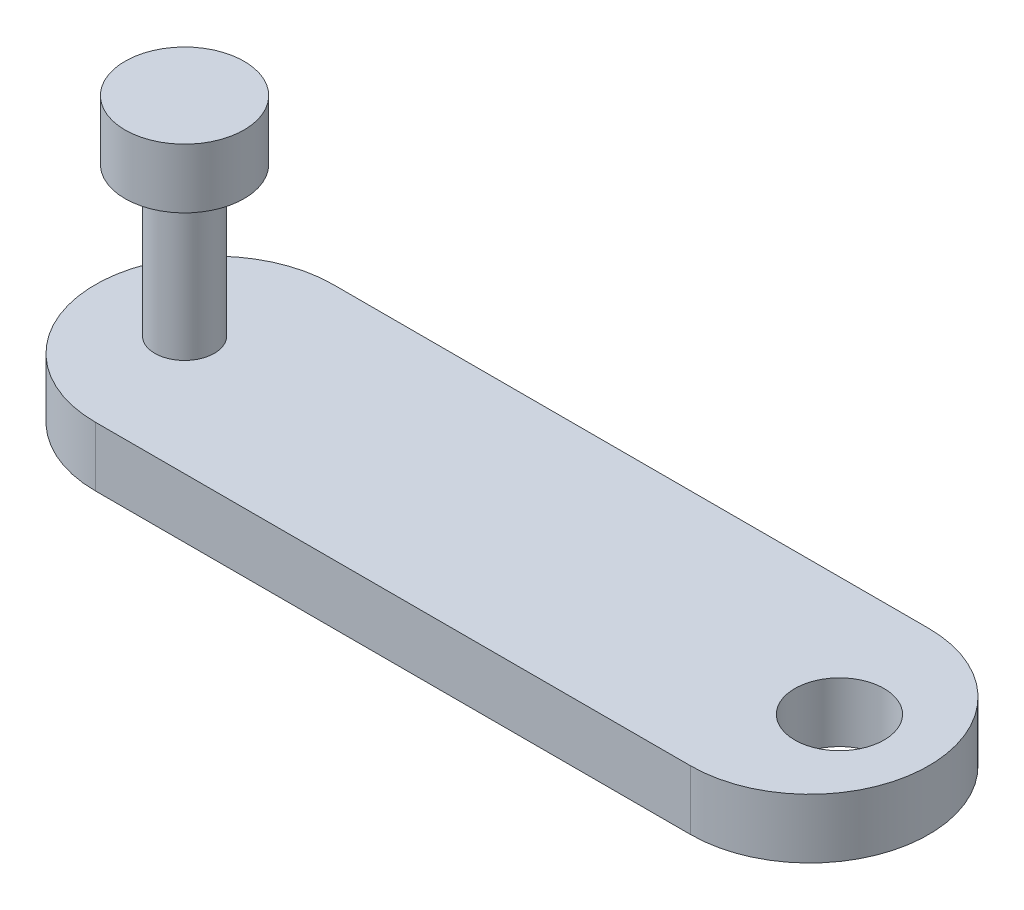
ISO-10303-21;
HEADER;
FILE_DESCRIPTION(('STEP AP214'),'2;1');
FILE_NAME('part.step','',(''),(''),'','','');
FILE_SCHEMA(('AUTOMOTIVE_DESIGN { 1 0 10303 214 1 1 1 1 }'));
ENDSEC;
DATA;
#1=APPLICATION_CONTEXT('core data for automotive mechanical design processes');
#2=APPLICATION_PROTOCOL_DEFINITION('international standard','automotive_design',2000,#1);
#3=PRODUCT_CONTEXT('',#1,'mechanical');
#4=PRODUCT('Part','Part','',(#3));
#5=PRODUCT_RELATED_PRODUCT_CATEGORY('part','',(#4));
#6=PRODUCT_DEFINITION_FORMATION('','',#4);
#7=PRODUCT_DEFINITION_CONTEXT('part definition',#1,'design');
#8=PRODUCT_DEFINITION('design','',#6,#7);
#9=PRODUCT_DEFINITION_SHAPE('','',#8);
#10=(LENGTH_UNIT() NAMED_UNIT(*) SI_UNIT(.MILLI.,.METRE.));
#11=(NAMED_UNIT(*) PLANE_ANGLE_UNIT() SI_UNIT($,.RADIAN.));
#12=(NAMED_UNIT(*) SI_UNIT($,.STERADIAN.) SOLID_ANGLE_UNIT());
#13=UNCERTAINTY_MEASURE_WITH_UNIT(LENGTH_MEASURE(1.E-05),#10,'distance_accuracy_value','');
#14=(GEOMETRIC_REPRESENTATION_CONTEXT(3) GLOBAL_UNCERTAINTY_ASSIGNED_CONTEXT((#13)) GLOBAL_UNIT_ASSIGNED_CONTEXT((#10,
#11,#12)) REPRESENTATION_CONTEXT('',''));
#15=CARTESIAN_POINT('',(0.,0.,0.));
#16=DIRECTION('',(0.,0.,1.));
#17=DIRECTION('',(1.,0.,0.));
#18=AXIS2_PLACEMENT_3D('',#15,#16,#17);
#19=CARTESIAN_POINT('',(-12.7,2.54,0.));
#20=DIRECTION('',(0.,1.,0.));
#21=DIRECTION('',(0.,0.,1.));
#22=AXIS2_PLACEMENT_3D('',#19,#20,#21);
#23=PLANE('',#22);
#24=CARTESIAN_POINT('',(13.97,2.54,0.));
#25=DIRECTION('',(0.,1.,0.));
#26=DIRECTION('',(0.,0.,1.));
#27=AXIS2_PLACEMENT_3D('',#24,#25,#26);
#28=CIRCLE('',#27,1.905);
#29=CARTESIAN_POINT('',(13.97,2.54,1.905));
#30=VERTEX_POINT('',#29);
#31=EDGE_CURVE('E123',#30,#30,#28,.T.);
#32=ORIENTED_EDGE('',*,*,#31,.F.);
#33=EDGE_LOOP('',(#32));
#34=FACE_BOUND('',#33,.T.);
#35=CARTESIAN_POINT('',(-12.7,2.54,0.));
#36=DIRECTION('',(0.,1.,0.));
#37=DIRECTION('',(0.,0.,1.));
#38=AXIS2_PLACEMENT_3D('',#35,#36,#37);
#39=CIRCLE('',#38,5.08);
#40=CARTESIAN_POINT('',(-12.7,2.54,-5.08));
#41=VERTEX_POINT('',#40);
#42=CARTESIAN_POINT('',(-12.7,2.54,5.08));
#43=VERTEX_POINT('',#42);
#44=EDGE_CURVE('E85',#41,#43,#39,.T.);
#45=ORIENTED_EDGE('',*,*,#44,.T.);
#46=DIRECTION('',(1.,0.,0.));
#47=VECTOR('',#46,1.);
#48=CARTESIAN_POINT('',(-12.7,2.54,5.08));
#49=LINE('',#48,#47);
#50=CARTESIAN_POINT('',(12.7,2.54,5.07999999999999));
#51=VERTEX_POINT('',#50);
#52=EDGE_CURVE('E80',#43,#51,#49,.T.);
#53=ORIENTED_EDGE('',*,*,#52,.T.);
#54=CARTESIAN_POINT('',(12.7,2.54,0.));
#55=DIRECTION('',(0.,1.,0.));
#56=DIRECTION('',(0.,0.,1.));
#57=AXIS2_PLACEMENT_3D('',#54,#55,#56);
#58=CIRCLE('',#57,5.08);
#59=CARTESIAN_POINT('',(12.7,2.54,-5.08));
#60=VERTEX_POINT('',#59);
#61=EDGE_CURVE('E83',#51,#60,#58,.T.);
#62=ORIENTED_EDGE('',*,*,#61,.T.);
#63=DIRECTION('',(-1.,0.,0.));
#64=VECTOR('',#63,1.);
#65=CARTESIAN_POINT('',(-12.7,2.54,-5.08));
#66=LINE('',#65,#64);
#67=EDGE_CURVE('E50',#60,#41,#66,.T.);
#68=ORIENTED_EDGE('',*,*,#67,.T.);
#69=EDGE_LOOP('',(#45,#53,#62,#68));
#70=FACE_BOUND('',#69,.T.);
#71=CARTESIAN_POINT('',(-13.97,2.54,0.));
#72=DIRECTION('',(0.,1.,0.));
#73=DIRECTION('',(0.,0.,1.));
#74=AXIS2_PLACEMENT_3D('',#71,#72,#73);
#75=CIRCLE('',#74,1.27);
#76=CARTESIAN_POINT('',(-13.97,2.54,1.27));
#77=VERTEX_POINT('',#76);
#78=EDGE_CURVE('E111',#77,#77,#75,.T.);
#79=ORIENTED_EDGE('',*,*,#78,.F.);
#80=EDGE_LOOP('',(#79));
#81=FACE_BOUND('',#80,.T.);
#82=ADVANCED_FACE('F33',(#34,#70,#81),#23,.T.);
#83=CARTESIAN_POINT('',(-12.7,2.54,0.));
#84=DIRECTION('',(0.,-1.,0.));
#85=DIRECTION('',(0.,0.,-1.));
#86=AXIS2_PLACEMENT_3D('',#83,#84,#85);
#87=CYLINDRICAL_SURFACE('',#86,5.08);
#88=CARTESIAN_POINT('',(-12.7,0.,0.));
#89=DIRECTION('',(0.,1.,0.));
#90=DIRECTION('',(0.,0.,1.));
#91=AXIS2_PLACEMENT_3D('',#88,#89,#90);
#92=CIRCLE('',#91,5.08);
#93=CARTESIAN_POINT('',(-12.7,0.,-5.08));
#94=VERTEX_POINT('',#93);
#95=CARTESIAN_POINT('',(-12.7,0.,5.08));
#96=VERTEX_POINT('',#95);
#97=EDGE_CURVE('E97',#94,#96,#92,.T.);
#98=ORIENTED_EDGE('',*,*,#97,.T.);
#99=DIRECTION('',(0.,-1.,0.));
#100=VECTOR('',#99,1.);
#101=CARTESIAN_POINT('',(-12.7,2.54,5.08));
#102=LINE('',#101,#100);
#103=EDGE_CURVE('E11',#43,#96,#102,.T.);
#104=ORIENTED_EDGE('',*,*,#103,.F.);
#105=ORIENTED_EDGE('',*,*,#44,.F.);
#106=DIRECTION('',(0.,-1.,0.));
#107=VECTOR('',#106,1.);
#108=CARTESIAN_POINT('',(-12.7,2.54,-5.08));
#109=LINE('',#108,#107);
#110=EDGE_CURVE('E93',#41,#94,#109,.T.);
#111=ORIENTED_EDGE('',*,*,#110,.T.);
#112=EDGE_LOOP('',(#98,#104,#105,#111));
#113=FACE_BOUND('',#112,.T.);
#114=ADVANCED_FACE('F35',(#113),#87,.T.);
#115=CARTESIAN_POINT('',(-12.7,2.54,5.08));
#116=DIRECTION('',(0.,0.,-1.));
#117=DIRECTION('',(-1.,0.,0.));
#118=AXIS2_PLACEMENT_3D('',#115,#116,#117);
#119=PLANE('',#118);
#120=DIRECTION('',(1.,0.,0.));
#121=VECTOR('',#120,1.);
#122=CARTESIAN_POINT('',(-12.7,0.,5.08));
#123=LINE('',#122,#121);
#124=CARTESIAN_POINT('',(12.7,0.,5.07999999999999));
#125=VERTEX_POINT('',#124);
#126=EDGE_CURVE('E89',#96,#125,#123,.T.);
#127=ORIENTED_EDGE('',*,*,#126,.T.);
#128=DIRECTION('',(0.,-1.,0.));
#129=VECTOR('',#128,1.);
#130=CARTESIAN_POINT('',(12.7,2.54,5.07999999999999));
#131=LINE('',#130,#129);
#132=EDGE_CURVE('E42',#51,#125,#131,.T.);
#133=ORIENTED_EDGE('',*,*,#132,.F.);
#134=ORIENTED_EDGE('',*,*,#52,.F.);
#135=ORIENTED_EDGE('',*,*,#103,.T.);
#136=EDGE_LOOP('',(#127,#133,#134,#135));
#137=FACE_BOUND('',#136,.T.);
#138=ADVANCED_FACE('F88',(#137),#119,.F.);
#139=CARTESIAN_POINT('',(12.7,2.54,0.));
#140=DIRECTION('',(0.,-1.,0.));
#141=DIRECTION('',(0.,0.,-1.));
#142=AXIS2_PLACEMENT_3D('',#139,#140,#141);
#143=CYLINDRICAL_SURFACE('',#142,5.08);
#144=CARTESIAN_POINT('',(12.7,0.,0.));
#145=DIRECTION('',(0.,1.,0.));
#146=DIRECTION('',(0.,0.,1.));
#147=AXIS2_PLACEMENT_3D('',#144,#145,#146);
#148=CIRCLE('',#147,5.08);
#149=CARTESIAN_POINT('',(12.7,0.,-5.08));
#150=VERTEX_POINT('',#149);
#151=EDGE_CURVE('E67',#125,#150,#148,.T.);
#152=ORIENTED_EDGE('',*,*,#151,.T.);
#153=DIRECTION('',(0.,-1.,0.));
#154=VECTOR('',#153,1.);
#155=CARTESIAN_POINT('',(12.7,2.54,-5.08));
#156=LINE('',#155,#154);
#157=EDGE_CURVE('E90',#60,#150,#156,.T.);
#158=ORIENTED_EDGE('',*,*,#157,.F.);
#159=ORIENTED_EDGE('',*,*,#61,.F.);
#160=ORIENTED_EDGE('',*,*,#132,.T.);
#161=EDGE_LOOP('',(#152,#158,#159,#160));
#162=FACE_BOUND('',#161,.T.);
#163=ADVANCED_FACE('F91',(#162),#143,.T.);
#164=CARTESIAN_POINT('',(-12.7,2.54,-5.08));
#165=DIRECTION('',(0.,0.,1.));
#166=DIRECTION('',(1.,0.,0.));
#167=AXIS2_PLACEMENT_3D('',#164,#165,#166);
#168=PLANE('',#167);
#169=DIRECTION('',(-1.,0.,0.));
#170=VECTOR('',#169,1.);
#171=CARTESIAN_POINT('',(-12.7,0.,-5.08));
#172=LINE('',#171,#170);
#173=EDGE_CURVE('E73',#150,#94,#172,.T.);
#174=ORIENTED_EDGE('',*,*,#173,.T.);
#175=ORIENTED_EDGE('',*,*,#110,.F.);
#176=ORIENTED_EDGE('',*,*,#67,.F.);
#177=ORIENTED_EDGE('',*,*,#157,.T.);
#178=EDGE_LOOP('',(#174,#175,#176,#177));
#179=FACE_BOUND('',#178,.T.);
#180=ADVANCED_FACE('F105',(#179),#168,.F.);
#181=CARTESIAN_POINT('',(-12.7,0.,0.));
#182=DIRECTION('',(0.,1.,0.));
#183=DIRECTION('',(0.,0.,1.));
#184=AXIS2_PLACEMENT_3D('',#181,#182,#183);
#185=PLANE('',#184);
#186=CARTESIAN_POINT('',(13.97,0.,0.));
#187=DIRECTION('',(0.,1.,0.));
#188=DIRECTION('',(0.,0.,1.));
#189=AXIS2_PLACEMENT_3D('',#186,#187,#188);
#190=CIRCLE('',#189,1.905);
#191=CARTESIAN_POINT('',(13.97,0.,1.905));
#192=VERTEX_POINT('',#191);
#193=EDGE_CURVE('E120',#192,#192,#190,.T.);
#194=ORIENTED_EDGE('',*,*,#193,.T.);
#195=EDGE_LOOP('',(#194));
#196=FACE_BOUND('',#195,.T.);
#197=ORIENTED_EDGE('',*,*,#97,.F.);
#198=ORIENTED_EDGE('',*,*,#173,.F.);
#199=ORIENTED_EDGE('',*,*,#151,.F.);
#200=ORIENTED_EDGE('',*,*,#126,.F.);
#201=EDGE_LOOP('',(#197,#198,#199,#200));
#202=FACE_BOUND('',#201,.T.);
#203=ADVANCED_FACE('F108',(#196,#202),#185,.F.);
#204=CARTESIAN_POINT('',(-13.97,8.89,0.));
#205=DIRECTION('',(0.,-1.,0.));
#206=DIRECTION('',(0.,0.,-1.));
#207=AXIS2_PLACEMENT_3D('',#204,#205,#206);
#208=CYLINDRICAL_SURFACE('',#207,1.27);
#209=CARTESIAN_POINT('',(-13.97,8.89,0.));
#210=DIRECTION('',(0.,1.,0.));
#211=DIRECTION('',(0.,0.,1.));
#212=AXIS2_PLACEMENT_3D('',#209,#210,#211);
#213=CIRCLE('',#212,1.27);
#214=CARTESIAN_POINT('',(-13.97,8.89,1.27));
#215=VERTEX_POINT('',#214);
#216=EDGE_CURVE('E100',#215,#215,#213,.T.);
#217=ORIENTED_EDGE('',*,*,#216,.F.);
#218=EDGE_LOOP('',(#217));
#219=FACE_BOUND('',#218,.T.);
#220=ORIENTED_EDGE('',*,*,#78,.T.);
#221=EDGE_LOOP('',(#220));
#222=FACE_BOUND('',#221,.T.);
#223=ADVANCED_FACE('F144',(#219,#222),#208,.T.);
#224=CARTESIAN_POINT('',(-13.97,8.89,0.));
#225=DIRECTION('',(0.,1.,0.));
#226=DIRECTION('',(0.,0.,1.));
#227=AXIS2_PLACEMENT_3D('',#224,#225,#226);
#228=PLANE('',#227);
#229=CARTESIAN_POINT('',(-13.97,8.89,0.));
#230=DIRECTION('',(0.,1.,0.));
#231=DIRECTION('',(0.,0.,1.));
#232=AXIS2_PLACEMENT_3D('',#229,#230,#231);
#233=CIRCLE('',#232,2.54);
#234=CARTESIAN_POINT('',(-13.97,8.89,2.54));
#235=VERTEX_POINT('',#234);
#236=EDGE_CURVE('E117',#235,#235,#233,.T.);
#237=ORIENTED_EDGE('',*,*,#236,.F.);
#238=EDGE_LOOP('',(#237));
#239=FACE_BOUND('',#238,.T.);
#240=ORIENTED_EDGE('',*,*,#216,.T.);
#241=EDGE_LOOP('',(#240));
#242=FACE_BOUND('',#241,.T.);
#243=ADVANCED_FACE('F175',(#239,#242),#228,.F.);
#244=CARTESIAN_POINT('',(-13.97,11.43,0.));
#245=DIRECTION('',(0.,-1.,0.));
#246=DIRECTION('',(0.,0.,-1.));
#247=AXIS2_PLACEMENT_3D('',#244,#245,#246);
#248=CYLINDRICAL_SURFACE('',#247,2.54);
#249=CARTESIAN_POINT('',(-13.97,11.43,0.));
#250=DIRECTION('',(0.,1.,0.));
#251=DIRECTION('',(0.,0.,1.));
#252=AXIS2_PLACEMENT_3D('',#249,#250,#251);
#253=CIRCLE('',#252,2.54);
#254=CARTESIAN_POINT('',(-13.97,11.43,2.54));
#255=VERTEX_POINT('',#254);
#256=EDGE_CURVE('E114',#255,#255,#253,.T.);
#257=ORIENTED_EDGE('',*,*,#256,.F.);
#258=EDGE_LOOP('',(#257));
#259=FACE_BOUND('',#258,.T.);
#260=ORIENTED_EDGE('',*,*,#236,.T.);
#261=EDGE_LOOP('',(#260));
#262=FACE_BOUND('',#261,.T.);
#263=ADVANCED_FACE('F182',(#259,#262),#248,.T.);
#264=CARTESIAN_POINT('',(-13.97,11.43,0.));
#265=DIRECTION('',(0.,1.,0.));
#266=DIRECTION('',(0.,0.,1.));
#267=AXIS2_PLACEMENT_3D('',#264,#265,#266);
#268=PLANE('',#267);
#269=ORIENTED_EDGE('',*,*,#256,.T.);
#270=EDGE_LOOP('',(#269));
#271=FACE_BOUND('',#270,.T.);
#272=ADVANCED_FACE('F133',(#271),#268,.T.);
#273=CARTESIAN_POINT('',(13.97,0.,0.));
#274=DIRECTION('',(0.,1.,0.));
#275=DIRECTION('',(0.,0.,1.));
#276=AXIS2_PLACEMENT_3D('',#273,#274,#275);
#277=CYLINDRICAL_SURFACE('',#276,1.905);
#278=ORIENTED_EDGE('',*,*,#193,.F.);
#279=EDGE_LOOP('',(#278));
#280=FACE_BOUND('',#279,.T.);
#281=ORIENTED_EDGE('',*,*,#31,.T.);
#282=EDGE_LOOP('',(#281));
#283=FACE_BOUND('',#282,.T.);
#284=ADVANCED_FACE('F130',(#280,#283),#277,.F.);
#285=CLOSED_SHELL('',(#82,#114,#138,#163,#180,#203,#223,#243,#263,#272,#284));
#286=MANIFOLD_SOLID_BREP('B2',#285);
#287=ADVANCED_BREP_SHAPE_REPRESENTATION('',(#18,#286),#14);
#288=SHAPE_DEFINITION_REPRESENTATION(#9,#287);
ENDSEC;
END-ISO-10303-21;
